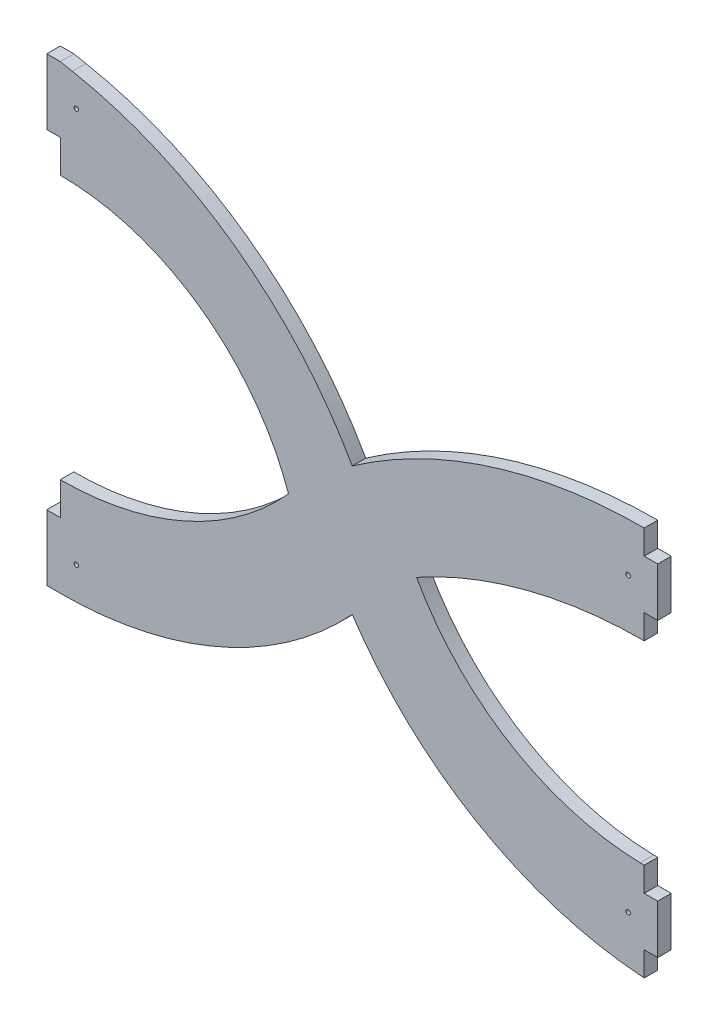
ISO-10303-21;
HEADER;
FILE_DESCRIPTION(('STEP AP214'),'2;1');
FILE_NAME('part.step','',(''),(''),'','','');
FILE_SCHEMA(('AUTOMOTIVE_DESIGN { 1 0 10303 214 1 1 1 1 }'));
ENDSEC;
DATA;
#1=APPLICATION_CONTEXT('core data for automotive mechanical design processes');
#2=APPLICATION_PROTOCOL_DEFINITION('international standard','automotive_design',2000,#1);
#3=PRODUCT_CONTEXT('',#1,'mechanical');
#4=PRODUCT('Part','Part','',(#3));
#5=PRODUCT_RELATED_PRODUCT_CATEGORY('part','',(#4));
#6=PRODUCT_DEFINITION_FORMATION('','',#4);
#7=PRODUCT_DEFINITION_CONTEXT('part definition',#1,'design');
#8=PRODUCT_DEFINITION('design','',#6,#7);
#9=PRODUCT_DEFINITION_SHAPE('','',#8);
#10=(LENGTH_UNIT() NAMED_UNIT(*) SI_UNIT(.MILLI.,.METRE.));
#11=(NAMED_UNIT(*) PLANE_ANGLE_UNIT() SI_UNIT($,.RADIAN.));
#12=(NAMED_UNIT(*) SI_UNIT($,.STERADIAN.) SOLID_ANGLE_UNIT());
#13=UNCERTAINTY_MEASURE_WITH_UNIT(LENGTH_MEASURE(1.E-05),#10,'distance_accuracy_value','');
#14=(GEOMETRIC_REPRESENTATION_CONTEXT(3) GLOBAL_UNCERTAINTY_ASSIGNED_CONTEXT((#13)) GLOBAL_UNIT_ASSIGNED_CONTEXT((#10,
#11,#12)) REPRESENTATION_CONTEXT('',''));
#15=CARTESIAN_POINT('',(0.,0.,0.));
#16=DIRECTION('',(0.,0.,1.));
#17=DIRECTION('',(1.,0.,0.));
#18=AXIS2_PLACEMENT_3D('',#15,#16,#17);
#19=CARTESIAN_POINT('',(-136.645797883599,-91.4289196894211,0.));
#20=DIRECTION('',(0.0703101448035491,0.997525179400352,0.));
#21=DIRECTION('',(-0.997525179400352,0.0703101448035491,0.));
#22=AXIS2_PLACEMENT_3D('',#19,#20,#21);
#23=PLANE('',#22);
#24=DIRECTION('',(0.,0.,1.));
#25=VECTOR('',#24,1.);
#26=CARTESIAN_POINT('',(93.309245370992,-107.637204676529,0.));
#27=LINE('',#26,#25);
#28=CARTESIAN_POINT('',(93.309245370992,-107.637204676529,0.));
#29=VERTEX_POINT('',#28);
#30=CARTESIAN_POINT('',(93.309245370992,-107.637204676529,5.334));
#31=VERTEX_POINT('',#30);
#32=EDGE_CURVE('E407',#29,#31,#27,.T.);
#33=ORIENTED_EDGE('',*,*,#32,.F.);
#34=DIRECTION('',(-0.997525179400352,0.0703101448035491,0.));
#35=VECTOR('',#34,1.);
#36=CARTESIAN_POINT('',(-136.645797883599,-91.4289196894211,0.));
#37=LINE('',#36,#35);
#38=CARTESIAN_POINT('',(93.9862021164005,-107.684919689421,0.));
#39=VERTEX_POINT('',#38);
#40=EDGE_CURVE('E403',#39,#29,#37,.T.);
#41=ORIENTED_EDGE('',*,*,#40,.F.);
#42=DIRECTION('',(0.,0.,1.));
#43=VECTOR('',#42,1.);
#44=CARTESIAN_POINT('',(93.9862021164005,-107.684919689421,0.));
#45=LINE('',#44,#43);
#46=CARTESIAN_POINT('',(93.9862021164005,-107.684919689421,5.334));
#47=VERTEX_POINT('',#46);
#48=EDGE_CURVE('E315',#39,#47,#45,.T.);
#49=ORIENTED_EDGE('',*,*,#48,.T.);
#50=DIRECTION('',(-0.997525179400352,0.0703101448035491,0.));
#51=VECTOR('',#50,1.);
#52=CARTESIAN_POINT('',(-136.645797883599,-91.4289196894211,5.334));
#53=LINE('',#52,#51);
#54=EDGE_CURVE('E398',#47,#31,#53,.T.);
#55=ORIENTED_EDGE('',*,*,#54,.T.);
#56=EDGE_LOOP('',(#33,#41,#49,#55));
#57=FACE_BOUND('',#56,.T.);
#58=ADVANCED_FACE('F35',(#57),#23,.F.);
#59=CARTESIAN_POINT('',(-136.6457978836,90.4350803105789,0.));
#60=DIRECTION('',(-0.188205466723379,-0.982129676924303,0.));
#61=DIRECTION('',(0.982129676924303,-0.188205466723379,0.));
#62=AXIS2_PLACEMENT_3D('',#59,#60,#61);
#63=PLANE('',#62);
#64=DIRECTION('',(0.,0.,1.));
#65=VECTOR('',#64,1.);
#66=CARTESIAN_POINT('',(-131.856888589873,89.5173818335872,0.));
#67=LINE('',#66,#65);
#68=CARTESIAN_POINT('',(-131.856888589873,89.5173818335872,0.));
#69=VERTEX_POINT('',#68);
#70=CARTESIAN_POINT('',(-131.856888589873,89.5173818335872,5.334));
#71=VERTEX_POINT('',#70);
#72=EDGE_CURVE('E448',#69,#71,#67,.T.);
#73=ORIENTED_EDGE('',*,*,#72,.F.);
#74=DIRECTION('',(0.982129676924303,-0.188205466723379,0.));
#75=VECTOR('',#74,1.);
#76=CARTESIAN_POINT('',(-136.6457978836,90.4350803105789,0.));
#77=LINE('',#76,#75);
#78=CARTESIAN_POINT('',(-136.6457978836,90.4350803105789,0.));
#79=VERTEX_POINT('',#78);
#80=EDGE_CURVE('E395',#79,#69,#77,.T.);
#81=ORIENTED_EDGE('',*,*,#80,.F.);
#82=DIRECTION('',(0.,0.,1.));
#83=VECTOR('',#82,1.);
#84=CARTESIAN_POINT('',(-136.6457978836,90.4350803105789,0.));
#85=LINE('',#84,#83);
#86=CARTESIAN_POINT('',(-136.6457978836,90.4350803105789,5.334));
#87=VERTEX_POINT('',#86);
#88=EDGE_CURVE('E392',#79,#87,#85,.T.);
#89=ORIENTED_EDGE('',*,*,#88,.T.);
#90=DIRECTION('',(0.982129676924303,-0.188205466723379,0.));
#91=VECTOR('',#90,1.);
#92=CARTESIAN_POINT('',(-136.6457978836,90.4350803105789,5.334));
#93=LINE('',#92,#91);
#94=EDGE_CURVE('E389',#87,#71,#93,.T.);
#95=ORIENTED_EDGE('',*,*,#94,.T.);
#96=EDGE_LOOP('',(#73,#81,#89,#95));
#97=FACE_BOUND('',#96,.T.);
#98=ADVANCED_FACE('F477',(#97),#63,.F.);
#99=CARTESIAN_POINT('',(93.9862021164005,17.2830803105789,0.));
#100=DIRECTION('',(-1.,0.,0.));
#101=DIRECTION('',(0.,-1.,0.));
#102=AXIS2_PLACEMENT_3D('',#99,#100,#101);
#103=PLANE('',#102);
#104=DIRECTION('',(0.,-1.,0.));
#105=VECTOR('',#104,1.);
#106=CARTESIAN_POINT('',(93.9862021164005,17.2830803105789,0.));
#107=LINE('',#106,#105);
#108=CARTESIAN_POINT('',(93.9862021164005,-69.0816387034577,0.));
#109=VERTEX_POINT('',#108);
#110=CARTESIAN_POINT('',(93.9862021164005,-78.7289196894211,0.));
#111=VERTEX_POINT('',#110);
#112=EDGE_CURVE('E277',#109,#111,#107,.T.);
#113=ORIENTED_EDGE('',*,*,#112,.F.);
#114=DIRECTION('',(0.,0.,1.));
#115=VECTOR('',#114,1.);
#116=CARTESIAN_POINT('',(93.9862021164005,-69.0816387034577,0.));
#117=LINE('',#116,#115);
#118=CARTESIAN_POINT('',(93.9862021164005,-69.0816387034577,5.334));
#119=VERTEX_POINT('',#118);
#120=EDGE_CURVE('E11',#109,#119,#117,.T.);
#121=ORIENTED_EDGE('',*,*,#120,.T.);
#122=DIRECTION('',(0.,-1.,0.));
#123=VECTOR('',#122,1.);
#124=CARTESIAN_POINT('',(93.9862021164005,17.2830803105789,5.334));
#125=LINE('',#124,#123);
#126=CARTESIAN_POINT('',(93.9862021164005,-78.7289196894211,5.334));
#127=VERTEX_POINT('',#126);
#128=EDGE_CURVE('E288',#119,#127,#125,.T.);
#129=ORIENTED_EDGE('',*,*,#128,.T.);
#130=DIRECTION('',(0.,0.,1.));
#131=VECTOR('',#130,1.);
#132=CARTESIAN_POINT('',(93.9862021164005,-78.7289196894211,0.));
#133=LINE('',#132,#131);
#134=EDGE_CURVE('E297',#111,#127,#133,.T.);
#135=ORIENTED_EDGE('',*,*,#134,.F.);
#136=EDGE_LOOP('',(#113,#121,#129,#135));
#137=FACE_BOUND('',#136,.T.);
#138=ADVANCED_FACE('F434',(#137),#103,.F.);
#139=CARTESIAN_POINT('',(-136.645797883599,-65.5209196894211,0.));
#140=DIRECTION('',(1.,0.,0.));
#141=DIRECTION('',(0.,0.,-1.));
#142=AXIS2_PLACEMENT_3D('',#139,#140,#141);
#143=PLANE('',#142);
#144=DIRECTION('',(0.,1.,0.));
#145=VECTOR('',#144,1.);
#146=CARTESIAN_POINT('',(-136.645797883599,-65.5209196894211,0.));
#147=LINE('',#146,#145);
#148=CARTESIAN_POINT('',(-136.6457978836,51.5730803105789,0.));
#149=VERTEX_POINT('',#148);
#150=CARTESIAN_POINT('',(-136.645797883599,64.5270803105789,0.));
#151=VERTEX_POINT('',#150);
#152=EDGE_CURVE('E354',#149,#151,#147,.T.);
#153=ORIENTED_EDGE('',*,*,#152,.F.);
#154=DIRECTION('',(0.,0.,1.));
#155=VECTOR('',#154,1.);
#156=CARTESIAN_POINT('',(-136.6457978836,51.5730803105789,0.));
#157=LINE('',#156,#155);
#158=CARTESIAN_POINT('',(-136.6457978836,51.5730803105789,5.334));
#159=VERTEX_POINT('',#158);
#160=EDGE_CURVE('E472',#149,#159,#157,.T.);
#161=ORIENTED_EDGE('',*,*,#160,.T.);
#162=DIRECTION('',(0.,1.,0.));
#163=VECTOR('',#162,1.);
#164=CARTESIAN_POINT('',(-136.645797883599,-65.5209196894211,5.334));
#165=LINE('',#164,#163);
#166=CARTESIAN_POINT('',(-136.645797883599,64.5270803105789,5.334));
#167=VERTEX_POINT('',#166);
#168=EDGE_CURVE('E371',#159,#167,#165,.T.);
#169=ORIENTED_EDGE('',*,*,#168,.T.);
#170=DIRECTION('',(0.,0.,1.));
#171=VECTOR('',#170,1.);
#172=CARTESIAN_POINT('',(-136.645797883599,64.5270803105789,0.));
#173=LINE('',#172,#171);
#174=EDGE_CURVE('E254',#151,#167,#173,.T.);
#175=ORIENTED_EDGE('',*,*,#174,.F.);
#176=EDGE_LOOP('',(#153,#161,#169,#175));
#177=FACE_BOUND('',#176,.T.);
#178=ADVANCED_FACE('F530',(#177),#143,.F.);
#179=CARTESIAN_POINT('',(-141.9797978836,90.4350803105789,5.334));
#180=DIRECTION('',(1.,0.,0.));
#181=DIRECTION('',(0.,0.,-1.));
#182=AXIS2_PLACEMENT_3D('',#179,#180,#181);
#183=PLANE('',#182);
#184=DIRECTION('',(0.,-1.,0.));
#185=VECTOR('',#184,1.);
#186=CARTESIAN_POINT('',(-141.9797978836,90.4350803105789,5.334));
#187=LINE('',#186,#185);
#188=CARTESIAN_POINT('',(-141.9797978836,-65.5209196894211,5.334));
#189=VERTEX_POINT('',#188);
#190=CARTESIAN_POINT('',(-141.9797978836,-91.4289196894211,5.334));
#191=VERTEX_POINT('',#190);
#192=EDGE_CURVE('E325',#189,#191,#187,.T.);
#193=ORIENTED_EDGE('',*,*,#192,.F.);
#194=DIRECTION('',(0.,0.,1.));
#195=VECTOR('',#194,1.);
#196=CARTESIAN_POINT('',(-141.9797978836,-65.5209196894211,0.));
#197=LINE('',#196,#195);
#198=CARTESIAN_POINT('',(-141.9797978836,-65.5209196894211,0.));
#199=VERTEX_POINT('',#198);
#200=EDGE_CURVE('E377',#199,#189,#197,.T.);
#201=ORIENTED_EDGE('',*,*,#200,.F.);
#202=DIRECTION('',(0.,-1.,0.));
#203=VECTOR('',#202,1.);
#204=CARTESIAN_POINT('',(-141.9797978836,90.4350803105789,0.));
#205=LINE('',#204,#203);
#206=CARTESIAN_POINT('',(-141.9797978836,-91.4289196894211,0.));
#207=VERTEX_POINT('',#206);
#208=EDGE_CURVE('E317',#199,#207,#205,.T.);
#209=ORIENTED_EDGE('',*,*,#208,.T.);
#210=DIRECTION('',(0.,0.,1.));
#211=VECTOR('',#210,1.);
#212=CARTESIAN_POINT('',(-141.9797978836,-91.4289196894211,0.));
#213=LINE('',#212,#211);
#214=EDGE_CURVE('E236',#207,#191,#213,.T.);
#215=ORIENTED_EDGE('',*,*,#214,.T.);
#216=EDGE_LOOP('',(#193,#201,#209,#215));
#217=FACE_BOUND('',#216,.T.);
#218=ADVANCED_FACE('F568',(#217),#183,.F.);
#219=CARTESIAN_POINT('',(99.3202021164005,90.4350803105789,5.334));
#220=DIRECTION('',(-1.,0.,0.));
#221=DIRECTION('',(0.,-1.,0.));
#222=AXIS2_PLACEMENT_3D('',#219,#220,#221);
#223=PLANE('',#222);
#224=DIRECTION('',(0.,1.,0.));
#225=VECTOR('',#224,1.);
#226=CARTESIAN_POINT('',(99.3202021164005,90.4350803105789,0.));
#227=LINE('',#226,#225);
#228=CARTESIAN_POINT('',(99.3202021164005,-98.0329196894211,0.));
#229=VERTEX_POINT('',#228);
#230=CARTESIAN_POINT('',(99.3202021164005,-78.7289196894211,0.));
#231=VERTEX_POINT('',#230);
#232=EDGE_CURVE('E335',#229,#231,#227,.T.);
#233=ORIENTED_EDGE('',*,*,#232,.T.);
#234=DIRECTION('',(0.,0.,1.));
#235=VECTOR('',#234,1.);
#236=CARTESIAN_POINT('',(99.3202021164005,-78.7289196894211,0.));
#237=LINE('',#236,#235);
#238=CARTESIAN_POINT('',(99.3202021164005,-78.7289196894211,5.334));
#239=VERTEX_POINT('',#238);
#240=EDGE_CURVE('E293',#231,#239,#237,.T.);
#241=ORIENTED_EDGE('',*,*,#240,.T.);
#242=DIRECTION('',(0.,1.,0.));
#243=VECTOR('',#242,1.);
#244=CARTESIAN_POINT('',(99.3202021164005,90.4350803105789,5.334));
#245=LINE('',#244,#243);
#246=CARTESIAN_POINT('',(99.3202021164005,-98.0329196894211,5.334));
#247=VERTEX_POINT('',#246);
#248=EDGE_CURVE('E326',#247,#239,#245,.T.);
#249=ORIENTED_EDGE('',*,*,#248,.F.);
#250=DIRECTION('',(0.,0.,1.));
#251=VECTOR('',#250,1.);
#252=CARTESIAN_POINT('',(99.3202021164005,-98.0329196894211,0.));
#253=LINE('',#252,#251);
#254=EDGE_CURVE('E310',#229,#247,#253,.T.);
#255=ORIENTED_EDGE('',*,*,#254,.F.);
#256=EDGE_LOOP('',(#233,#241,#249,#255));
#257=FACE_BOUND('',#256,.T.);
#258=ADVANCED_FACE('F422',(#257),#223,.F.);
#259=CARTESIAN_POINT('',(-141.9797978836,90.4350803105789,0.));
#260=VERTEX_POINT('',#259);
#261=CARTESIAN_POINT('',(-141.9797978836,64.5270803105789,0.));
#262=VERTEX_POINT('',#261);
#263=EDGE_CURVE('E331',#260,#262,#205,.T.);
#264=ORIENTED_EDGE('',*,*,#263,.T.);
#265=DIRECTION('',(0.,0.,1.));
#266=VECTOR('',#265,1.);
#267=CARTESIAN_POINT('',(-141.9797978836,64.5270803105789,0.));
#268=LINE('',#267,#266);
#269=CARTESIAN_POINT('',(-141.9797978836,64.5270803105789,5.334));
#270=VERTEX_POINT('',#269);
#271=EDGE_CURVE('E378',#262,#270,#268,.T.);
#272=ORIENTED_EDGE('',*,*,#271,.T.);
#273=CARTESIAN_POINT('',(-141.9797978836,90.4350803105789,5.334));
#274=VERTEX_POINT('',#273);
#275=EDGE_CURVE('E321',#274,#270,#187,.T.);
#276=ORIENTED_EDGE('',*,*,#275,.F.);
#277=DIRECTION('',(0.,0.,-1.));
#278=VECTOR('',#277,1.);
#279=CARTESIAN_POINT('',(-141.9797978836,90.4350803105789,5.334));
#280=LINE('',#279,#278);
#281=EDGE_CURVE('E43',#274,#260,#280,.T.);
#282=ORIENTED_EDGE('',*,*,#281,.T.);
#283=EDGE_LOOP('',(#264,#272,#276,#282));
#284=FACE_BOUND('',#283,.T.);
#285=ADVANCED_FACE('F37',(#284),#183,.F.);
#286=CARTESIAN_POINT('',(99.3202021164005,17.2830803105789,0.));
#287=VERTEX_POINT('',#286);
#288=CARTESIAN_POINT('',(99.3202021164005,36.5870803105789,0.));
#289=VERTEX_POINT('',#288);
#290=EDGE_CURVE('E334',#287,#289,#227,.T.);
#291=ORIENTED_EDGE('',*,*,#290,.T.);
#292=DIRECTION('',(0.,0.,1.));
#293=VECTOR('',#292,1.);
#294=CARTESIAN_POINT('',(99.3202021164005,36.5870803105789,0.));
#295=LINE('',#294,#293);
#296=CARTESIAN_POINT('',(99.3202021164005,36.5870803105789,5.334));
#297=VERTEX_POINT('',#296);
#298=EDGE_CURVE('E268',#289,#297,#295,.T.);
#299=ORIENTED_EDGE('',*,*,#298,.T.);
#300=CARTESIAN_POINT('',(99.3202021164005,17.2830803105789,5.334));
#301=VERTEX_POINT('',#300);
#302=EDGE_CURVE('E324',#301,#297,#245,.T.);
#303=ORIENTED_EDGE('',*,*,#302,.F.);
#304=DIRECTION('',(0.,0.,1.));
#305=VECTOR('',#304,1.);
#306=CARTESIAN_POINT('',(99.3202021164005,17.2830803105789,0.));
#307=LINE('',#306,#305);
#308=EDGE_CURVE('E285',#287,#301,#307,.T.);
#309=ORIENTED_EDGE('',*,*,#308,.F.);
#310=EDGE_LOOP('',(#291,#299,#303,#309));
#311=FACE_BOUND('',#310,.T.);
#312=ADVANCED_FACE('F562',(#311),#223,.F.);
#313=CARTESIAN_POINT('',(-141.9797978836,90.4350803105789,5.334));
#314=DIRECTION('',(0.,-1.,0.));
#315=DIRECTION('',(0.,0.,-1.));
#316=AXIS2_PLACEMENT_3D('',#313,#314,#315);
#317=PLANE('',#316);
#318=DIRECTION('',(-1.,0.,0.));
#319=VECTOR('',#318,1.);
#320=CARTESIAN_POINT('',(-141.9797978836,90.4350803105789,5.334));
#321=LINE('',#320,#319);
#322=EDGE_CURVE('E329',#87,#274,#321,.T.);
#323=ORIENTED_EDGE('',*,*,#322,.F.);
#324=ORIENTED_EDGE('',*,*,#88,.F.);
#325=DIRECTION('',(-1.,0.,0.));
#326=VECTOR('',#325,1.);
#327=CARTESIAN_POINT('',(-141.9797978836,90.4350803105789,0.));
#328=LINE('',#327,#326);
#329=EDGE_CURVE('E338',#79,#260,#328,.T.);
#330=ORIENTED_EDGE('',*,*,#329,.T.);
#331=ORIENTED_EDGE('',*,*,#281,.F.);
#332=EDGE_LOOP('',(#323,#324,#330,#331));
#333=FACE_BOUND('',#332,.T.);
#334=ADVANCED_FACE('F391',(#333),#317,.F.);
#335=CARTESIAN_POINT('',(0.,0.,5.334));
#336=DIRECTION('',(0.,0.,1.));
#337=DIRECTION('',(1.,0.,0.));
#338=AXIS2_PLACEMENT_3D('',#335,#336,#337);
#339=PLANE('',#338);
#340=CARTESIAN_POINT('',(87.6362021164005,-88.3809196894211,5.334));
#341=DIRECTION('',(0.,0.,1.));
#342=DIRECTION('',(-1.,0.,0.));
#343=AXIS2_PLACEMENT_3D('',#340,#341,#342);
#344=CIRCLE('',#343,0.888999999999989);
#345=CARTESIAN_POINT('',(86.7472021164005,-88.3809196894211,5.334));
#346=VERTEX_POINT('',#345);
#347=EDGE_CURVE('E715',#346,#346,#344,.T.);
#348=ORIENTED_EDGE('',*,*,#347,.F.);
#349=EDGE_LOOP('',(#348));
#350=FACE_BOUND('',#349,.T.);
#351=CARTESIAN_POINT('',(87.6362021164005,26.9350803105789,5.334));
#352=DIRECTION('',(0.,0.,1.));
#353=DIRECTION('',(1.,0.,0.));
#354=AXIS2_PLACEMENT_3D('',#351,#352,#353);
#355=CIRCLE('',#354,0.889000000000003);
#356=CARTESIAN_POINT('',(88.5252021164005,26.9350803105789,5.334));
#357=VERTEX_POINT('',#356);
#358=EDGE_CURVE('E717',#357,#357,#355,.T.);
#359=ORIENTED_EDGE('',*,*,#358,.F.);
#360=EDGE_LOOP('',(#359));
#361=FACE_BOUND('',#360,.T.);
#362=CARTESIAN_POINT('',(-130.2957978836,-78.4749196894211,5.334));
#363=DIRECTION('',(0.,0.,1.));
#364=DIRECTION('',(-1.,0.,0.));
#365=AXIS2_PLACEMENT_3D('',#362,#363,#364);
#366=CIRCLE('',#365,0.888999999999989);
#367=CARTESIAN_POINT('',(-131.1847978836,-78.4749196894211,5.334));
#368=VERTEX_POINT('',#367);
#369=EDGE_CURVE('E723',#368,#368,#366,.T.);
#370=ORIENTED_EDGE('',*,*,#369,.F.);
#371=EDGE_LOOP('',(#370));
#372=FACE_BOUND('',#371,.T.);
#373=CARTESIAN_POINT('',(-130.2957978836,77.4810803105789,5.334));
#374=DIRECTION('',(0.,0.,1.));
#375=DIRECTION('',(1.,0.,0.));
#376=AXIS2_PLACEMENT_3D('',#373,#374,#375);
#377=CIRCLE('',#376,0.888999999999989);
#378=CARTESIAN_POINT('',(-129.4067978836,77.4810803105789,5.334));
#379=VERTEX_POINT('',#378);
#380=EDGE_CURVE('E729',#379,#379,#377,.T.);
#381=ORIENTED_EDGE('',*,*,#380,.F.);
#382=EDGE_LOOP('',(#381));
#383=FACE_BOUND('',#382,.T.);
#384=CARTESIAN_POINT('',(-136.6457978836,65.6532856002515,5.334));
#385=DIRECTION('',(0.,0.,-1.));
#386=DIRECTION('',(1.,0.,0.));
#387=AXIS2_PLACEMENT_3D('',#384,#385,#386);
#388=CIRCLE('',#387,157.082205289673);
#389=CARTESIAN_POINT('',(-21.3297978835995,-41.0099196894211,5.334));
#390=VERTEX_POINT('',#389);
#391=CARTESIAN_POINT('',(-136.645797883599,-91.4289196894211,5.334));
#392=VERTEX_POINT('',#391);
#393=EDGE_CURVE('E231',#390,#392,#388,.T.);
#394=ORIENTED_EDGE('',*,*,#393,.F.);
#395=CARTESIAN_POINT('',(103.892338032469,42.5098152847798,5.334));
#396=DIRECTION('',(0.,0.,-1.));
#397=DIRECTION('',(-1.,0.,0.));
#398=AXIS2_PLACEMENT_3D('',#395,#396,#397);
#399=CIRCLE('',#398,150.519531800837);
#400=EDGE_CURVE('E244',#31,#390,#399,.T.);
#401=ORIENTED_EDGE('',*,*,#400,.F.);
#402=ORIENTED_EDGE('',*,*,#54,.F.);
#403=DIRECTION('',(0.,-1.,0.));
#404=VECTOR('',#403,1.);
#405=CARTESIAN_POINT('',(93.9862021164005,-107.684919689421,5.334));
#406=LINE('',#405,#404);
#407=CARTESIAN_POINT('',(93.9862021164005,-98.0329196894211,5.334));
#408=VERTEX_POINT('',#407);
#409=EDGE_CURVE('E307',#408,#47,#406,.T.);
#410=ORIENTED_EDGE('',*,*,#409,.F.);
#411=DIRECTION('',(-1.,0.,0.));
#412=VECTOR('',#411,1.);
#413=CARTESIAN_POINT('',(99.3202021164005,-98.0329196894211,5.334));
#414=LINE('',#413,#412);
#415=EDGE_CURVE('E296',#247,#408,#414,.T.);
#416=ORIENTED_EDGE('',*,*,#415,.F.);
#417=ORIENTED_EDGE('',*,*,#248,.T.);
#418=DIRECTION('',(1.,0.,0.));
#419=VECTOR('',#418,1.);
#420=CARTESIAN_POINT('',(99.3202021164005,-78.7289196894211,5.334));
#421=LINE('',#420,#419);
#422=EDGE_CURVE('E278',#127,#239,#421,.T.);
#423=ORIENTED_EDGE('',*,*,#422,.F.);
#424=ORIENTED_EDGE('',*,*,#128,.F.);
#425=CARTESIAN_POINT('',(93.277488402385,-30.7252791964394,5.334));
#426=DIRECTION('',(0.,0.,1.));
#427=DIRECTION('',(1.,0.,0.));
#428=AXIS2_PLACEMENT_3D('',#425,#426,#427);
#429=CIRCLE('',#428,38.3629064300408);
#430=CARTESIAN_POINT('',(92.3478318759479,-69.0769196894211,5.334));
#431=VERTEX_POINT('',#430);
#432=EDGE_CURVE('E438',#431,#119,#429,.T.);
#433=ORIENTED_EDGE('',*,*,#432,.F.);
#434=CARTESIAN_POINT('',(94.8630692227126,34.6855729459791,5.334));
#435=DIRECTION('',(0.,0.,1.));
#436=DIRECTION('',(1.,0.,0.));
#437=AXIS2_PLACEMENT_3D('',#434,#435,#436);
#438=CIRCLE('',#437,103.792973253598);
#439=CARTESIAN_POINT('',(4.07020211640044,-15.6099196894211,5.334));
#440=VERTEX_POINT('',#439);
#441=EDGE_CURVE('E441',#440,#431,#438,.T.);
#442=ORIENTED_EDGE('',*,*,#441,.F.);
#443=CARTESIAN_POINT('',(93.9862021164005,-177.92528854188,5.334));
#444=DIRECTION('',(0.,0.,1.));
#445=DIRECTION('',(1.,0.,0.));
#446=AXIS2_PLACEMENT_3D('',#443,#444,#445);
#447=CIRCLE('',#446,185.556368852459);
#448=CARTESIAN_POINT('',(93.9862021164005,7.63108031057891,5.334));
#449=VERTEX_POINT('',#448);
#450=EDGE_CURVE('E443',#449,#440,#447,.T.);
#451=ORIENTED_EDGE('',*,*,#450,.F.);
#452=CARTESIAN_POINT('',(93.9862021164005,17.2830803105789,5.334));
#453=VERTEX_POINT('',#452);
#454=EDGE_CURVE('E289',#453,#449,#125,.T.);
#455=ORIENTED_EDGE('',*,*,#454,.F.);
#456=DIRECTION('',(-1.,0.,0.));
#457=VECTOR('',#456,1.);
#458=CARTESIAN_POINT('',(93.9862021164005,17.2830803105789,5.334));
#459=LINE('',#458,#457);
#460=EDGE_CURVE('E271',#301,#453,#459,.T.);
#461=ORIENTED_EDGE('',*,*,#460,.F.);
#462=ORIENTED_EDGE('',*,*,#302,.T.);
#463=DIRECTION('',(1.,0.,0.));
#464=VECTOR('',#463,1.);
#465=CARTESIAN_POINT('',(99.3202021164005,36.5870803105789,5.334));
#466=LINE('',#465,#464);
#467=CARTESIAN_POINT('',(93.9862021164005,36.5870803105789,5.334));
#468=VERTEX_POINT('',#467);
#469=EDGE_CURVE('E262',#468,#297,#466,.T.);
#470=ORIENTED_EDGE('',*,*,#469,.F.);
#471=DIRECTION('',(0.,-1.,0.));
#472=VECTOR('',#471,1.);
#473=CARTESIAN_POINT('',(93.9862021164005,90.4350803105789,5.334));
#474=LINE('',#473,#472);
#475=CARTESIAN_POINT('',(93.9862021164005,46.2390803105789,5.334));
#476=VERTEX_POINT('',#475);
#477=EDGE_CURVE('E257',#476,#468,#474,.T.);
#478=ORIENTED_EDGE('',*,*,#477,.F.);
#479=CARTESIAN_POINT('',(93.9862021164005,-154.401670560501,5.334));
#480=DIRECTION('',(0.,0.,-1.));
#481=DIRECTION('',(1.,0.,0.));
#482=AXIS2_PLACEMENT_3D('',#479,#480,#481);
#483=CIRCLE('',#482,200.64075087108);
#484=CARTESIAN_POINT('',(-21.3297978835995,9.79008031057889,5.334));
#485=VERTEX_POINT('',#484);
#486=EDGE_CURVE('E489',#485,#476,#483,.T.);
#487=ORIENTED_EDGE('',*,*,#486,.F.);
#488=CARTESIAN_POINT('',(-162.252135711497,-69.0962698032817,5.334));
#489=DIRECTION('',(0.,0.,-1.));
#490=DIRECTION('',(-1.,0.,0.));
#491=AXIS2_PLACEMENT_3D('',#488,#489,#490);
#492=CIRCLE('',#491,161.499726108643);
#493=EDGE_CURVE('E485',#71,#485,#492,.T.);
#494=ORIENTED_EDGE('',*,*,#493,.F.);
#495=ORIENTED_EDGE('',*,*,#94,.F.);
#496=ORIENTED_EDGE('',*,*,#322,.T.);
#497=ORIENTED_EDGE('',*,*,#275,.T.);
#498=DIRECTION('',(-1.,0.,0.));
#499=VECTOR('',#498,1.);
#500=CARTESIAN_POINT('',(-136.645797883599,64.5270803105789,5.334));
#501=LINE('',#500,#499);
#502=EDGE_CURVE('E370',#167,#270,#501,.T.);
#503=ORIENTED_EDGE('',*,*,#502,.F.);
#504=ORIENTED_EDGE('',*,*,#168,.F.);
#505=CARTESIAN_POINT('',(-136.6457978836,-43.9510846803431,5.334));
#506=DIRECTION('',(0.,0.,1.));
#507=DIRECTION('',(-1.,0.,0.));
#508=AXIS2_PLACEMENT_3D('',#505,#506,#507);
#509=CIRCLE('',#508,95.5241649909219);
#510=CARTESIAN_POINT('',(-46.5144329806666,-12.3092901998275,5.334));
#511=VERTEX_POINT('',#510);
#512=EDGE_CURVE('E466',#511,#159,#509,.T.);
#513=ORIENTED_EDGE('',*,*,#512,.F.);
#514=CARTESIAN_POINT('',(-136.645797883599,68.4578375420735,5.334));
#515=DIRECTION('',(0.,0.,1.));
#516=DIRECTION('',(1.,0.,0.));
#517=AXIS2_PLACEMENT_3D('',#514,#515,#516);
#518=CIRCLE('',#517,121.024757231495);
#519=CARTESIAN_POINT('',(-136.6457978836,-52.5669196894211,5.334));
#520=VERTEX_POINT('',#519);
#521=EDGE_CURVE('E457',#520,#511,#518,.T.);
#522=ORIENTED_EDGE('',*,*,#521,.F.);
#523=CARTESIAN_POINT('',(-136.645797883599,-65.5209196894211,5.334));
#524=VERTEX_POINT('',#523);
#525=EDGE_CURVE('E367',#524,#520,#165,.T.);
#526=ORIENTED_EDGE('',*,*,#525,.F.);
#527=DIRECTION('',(1.,0.,0.));
#528=VECTOR('',#527,1.);
#529=CARTESIAN_POINT('',(-136.645797883599,-65.5209196894211,5.334));
#530=LINE('',#529,#528);
#531=EDGE_CURVE('E373',#189,#524,#530,.T.);
#532=ORIENTED_EDGE('',*,*,#531,.F.);
#533=ORIENTED_EDGE('',*,*,#192,.T.);
#534=DIRECTION('',(-1.,0.,0.));
#535=VECTOR('',#534,1.);
#536=CARTESIAN_POINT('',(-141.9797978836,-91.4289196894211,5.334));
#537=LINE('',#536,#535);
#538=EDGE_CURVE('E249',#392,#191,#537,.T.);
#539=ORIENTED_EDGE('',*,*,#538,.F.);
#540=EDGE_LOOP('',(#394,#401,#402,#410,#416,#417,#423,#424,#433,#442,#451,#455,#461,#462,#470,
#478,#487,#494,#495,#496,#497,#503,#504,#513,#522,#526,#532,#533,#539));
#541=FACE_BOUND('',#540,.T.);
#542=ADVANCED_FACE('F384',(#350,#361,#372,#383,#541),#339,.T.);
#543=CARTESIAN_POINT('',(0.,0.,0.));
#544=DIRECTION('',(0.,0.,1.));
#545=DIRECTION('',(1.,0.,0.));
#546=AXIS2_PLACEMENT_3D('',#543,#544,#545);
#547=PLANE('',#546);
#548=CARTESIAN_POINT('',(87.6362021164005,-88.3809196894211,0.));
#549=DIRECTION('',(0.,0.,1.));
#550=DIRECTION('',(-1.,0.,0.));
#551=AXIS2_PLACEMENT_3D('',#548,#549,#550);
#552=CIRCLE('',#551,0.888999999999989);
#553=CARTESIAN_POINT('',(86.7472021164005,-88.3809196894211,0.));
#554=VERTEX_POINT('',#553);
#555=EDGE_CURVE('E712',#554,#554,#552,.T.);
#556=ORIENTED_EDGE('',*,*,#555,.T.);
#557=EDGE_LOOP('',(#556));
#558=FACE_BOUND('',#557,.T.);
#559=CARTESIAN_POINT('',(87.6362021164005,26.9350803105789,0.));
#560=DIRECTION('',(0.,0.,1.));
#561=DIRECTION('',(1.,0.,0.));
#562=AXIS2_PLACEMENT_3D('',#559,#560,#561);
#563=CIRCLE('',#562,0.889000000000003);
#564=CARTESIAN_POINT('',(88.5252021164005,26.9350803105789,0.));
#565=VERTEX_POINT('',#564);
#566=EDGE_CURVE('E720',#565,#565,#563,.T.);
#567=ORIENTED_EDGE('',*,*,#566,.T.);
#568=EDGE_LOOP('',(#567));
#569=FACE_BOUND('',#568,.T.);
#570=CARTESIAN_POINT('',(-130.2957978836,-78.4749196894211,0.));
#571=DIRECTION('',(0.,0.,1.));
#572=DIRECTION('',(-1.,0.,0.));
#573=AXIS2_PLACEMENT_3D('',#570,#571,#572);
#574=CIRCLE('',#573,0.888999999999989);
#575=CARTESIAN_POINT('',(-131.1847978836,-78.4749196894211,0.));
#576=VERTEX_POINT('',#575);
#577=EDGE_CURVE('E726',#576,#576,#574,.T.);
#578=ORIENTED_EDGE('',*,*,#577,.T.);
#579=EDGE_LOOP('',(#578));
#580=FACE_BOUND('',#579,.T.);
#581=CARTESIAN_POINT('',(-130.2957978836,77.4810803105789,0.));
#582=DIRECTION('',(0.,0.,1.));
#583=DIRECTION('',(1.,0.,0.));
#584=AXIS2_PLACEMENT_3D('',#581,#582,#583);
#585=CIRCLE('',#584,0.888999999999989);
#586=CARTESIAN_POINT('',(-129.4067978836,77.4810803105789,0.));
#587=VERTEX_POINT('',#586);
#588=EDGE_CURVE('E732',#587,#587,#585,.T.);
#589=ORIENTED_EDGE('',*,*,#588,.T.);
#590=EDGE_LOOP('',(#589));
#591=FACE_BOUND('',#590,.T.);
#592=CARTESIAN_POINT('',(103.892338032469,42.5098152847798,0.));
#593=DIRECTION('',(0.,0.,-1.));
#594=DIRECTION('',(-1.,0.,0.));
#595=AXIS2_PLACEMENT_3D('',#592,#593,#594);
#596=CIRCLE('',#595,150.519531800837);
#597=CARTESIAN_POINT('',(-21.3297978835995,-41.0099196894211,0.));
#598=VERTEX_POINT('',#597);
#599=EDGE_CURVE('E50',#29,#598,#596,.T.);
#600=ORIENTED_EDGE('',*,*,#599,.T.);
#601=CARTESIAN_POINT('',(-136.6457978836,65.6532856002515,0.));
#602=DIRECTION('',(0.,0.,-1.));
#603=DIRECTION('',(1.,0.,0.));
#604=AXIS2_PLACEMENT_3D('',#601,#602,#603);
#605=CIRCLE('',#604,157.082205289673);
#606=CARTESIAN_POINT('',(-136.645797883599,-91.4289196894211,0.));
#607=VERTEX_POINT('',#606);
#608=EDGE_CURVE('E229',#598,#607,#605,.T.);
#609=ORIENTED_EDGE('',*,*,#608,.T.);
#610=DIRECTION('',(-1.,0.,0.));
#611=VECTOR('',#610,1.);
#612=CARTESIAN_POINT('',(-141.9797978836,-91.4289196894211,0.));
#613=LINE('',#612,#611);
#614=EDGE_CURVE('E237',#607,#207,#613,.T.);
#615=ORIENTED_EDGE('',*,*,#614,.T.);
#616=ORIENTED_EDGE('',*,*,#208,.F.);
#617=DIRECTION('',(1.,0.,0.));
#618=VECTOR('',#617,1.);
#619=CARTESIAN_POINT('',(-136.645797883599,-65.5209196894211,0.));
#620=LINE('',#619,#618);
#621=CARTESIAN_POINT('',(-136.645797883599,-65.5209196894211,0.));
#622=VERTEX_POINT('',#621);
#623=EDGE_CURVE('E358',#199,#622,#620,.T.);
#624=ORIENTED_EDGE('',*,*,#623,.T.);
#625=CARTESIAN_POINT('',(-136.645797883599,-52.5669196894211,0.));
#626=VERTEX_POINT('',#625);
#627=EDGE_CURVE('E359',#622,#626,#147,.T.);
#628=ORIENTED_EDGE('',*,*,#627,.T.);
#629=CARTESIAN_POINT('',(-136.645797883599,68.4578375420735,0.));
#630=DIRECTION('',(0.,0.,1.));
#631=DIRECTION('',(1.,0.,0.));
#632=AXIS2_PLACEMENT_3D('',#629,#630,#631);
#633=CIRCLE('',#632,121.024757231495);
#634=CARTESIAN_POINT('',(-46.5144329806666,-12.3092901998275,0.));
#635=VERTEX_POINT('',#634);
#636=EDGE_CURVE('E462',#626,#635,#633,.T.);
#637=ORIENTED_EDGE('',*,*,#636,.T.);
#638=CARTESIAN_POINT('',(-136.6457978836,-43.9510846803431,0.));
#639=DIRECTION('',(0.,0.,1.));
#640=DIRECTION('',(-1.,0.,0.));
#641=AXIS2_PLACEMENT_3D('',#638,#639,#640);
#642=CIRCLE('',#641,95.5241649909219);
#643=EDGE_CURVE('E465',#635,#149,#642,.T.);
#644=ORIENTED_EDGE('',*,*,#643,.T.);
#645=ORIENTED_EDGE('',*,*,#152,.T.);
#646=DIRECTION('',(-1.,0.,0.));
#647=VECTOR('',#646,1.);
#648=CARTESIAN_POINT('',(-136.645797883599,64.5270803105789,0.));
#649=LINE('',#648,#647);
#650=EDGE_CURVE('E351',#151,#262,#649,.T.);
#651=ORIENTED_EDGE('',*,*,#650,.T.);
#652=ORIENTED_EDGE('',*,*,#263,.F.);
#653=ORIENTED_EDGE('',*,*,#329,.F.);
#654=ORIENTED_EDGE('',*,*,#80,.T.);
#655=CARTESIAN_POINT('',(-162.252135711497,-69.0962698032817,0.));
#656=DIRECTION('',(0.,0.,-1.));
#657=DIRECTION('',(-1.,0.,0.));
#658=AXIS2_PLACEMENT_3D('',#655,#656,#657);
#659=CIRCLE('',#658,161.499726108643);
#660=CARTESIAN_POINT('',(-21.3297978835995,9.79008031057889,0.));
#661=VERTEX_POINT('',#660);
#662=EDGE_CURVE('E58',#69,#661,#659,.T.);
#663=ORIENTED_EDGE('',*,*,#662,.T.);
#664=CARTESIAN_POINT('',(93.9862021164005,-154.401670560501,0.));
#665=DIRECTION('',(0.,0.,-1.));
#666=DIRECTION('',(1.,0.,0.));
#667=AXIS2_PLACEMENT_3D('',#664,#665,#666);
#668=CIRCLE('',#667,200.64075087108);
#669=CARTESIAN_POINT('',(93.9862021164005,46.2390803105789,0.));
#670=VERTEX_POINT('',#669);
#671=EDGE_CURVE('E482',#661,#670,#668,.T.);
#672=ORIENTED_EDGE('',*,*,#671,.T.);
#673=DIRECTION('',(0.,-1.,0.));
#674=VECTOR('',#673,1.);
#675=CARTESIAN_POINT('',(93.9862021164005,90.4350803105789,0.));
#676=LINE('',#675,#674);
#677=CARTESIAN_POINT('',(93.9862021164005,36.5870803105789,0.));
#678=VERTEX_POINT('',#677);
#679=EDGE_CURVE('E259',#670,#678,#676,.T.);
#680=ORIENTED_EDGE('',*,*,#679,.T.);
#681=DIRECTION('',(1.,0.,0.));
#682=VECTOR('',#681,1.);
#683=CARTESIAN_POINT('',(99.3202021164005,36.5870803105789,0.));
#684=LINE('',#683,#682);
#685=EDGE_CURVE('E261',#678,#289,#684,.T.);
#686=ORIENTED_EDGE('',*,*,#685,.T.);
#687=ORIENTED_EDGE('',*,*,#290,.F.);
#688=DIRECTION('',(-1.,0.,0.));
#689=VECTOR('',#688,1.);
#690=CARTESIAN_POINT('',(93.9862021164005,17.2830803105789,0.));
#691=LINE('',#690,#689);
#692=CARTESIAN_POINT('',(93.9862021164005,17.2830803105789,0.));
#693=VERTEX_POINT('',#692);
#694=EDGE_CURVE('E274',#287,#693,#691,.T.);
#695=ORIENTED_EDGE('',*,*,#694,.T.);
#696=CARTESIAN_POINT('',(93.9862021164005,7.63108031057891,0.));
#697=VERTEX_POINT('',#696);
#698=EDGE_CURVE('E279',#693,#697,#107,.T.);
#699=ORIENTED_EDGE('',*,*,#698,.T.);
#700=CARTESIAN_POINT('',(93.9862021164005,-177.92528854188,0.));
#701=DIRECTION('',(0.,0.,1.));
#702=DIRECTION('',(1.,0.,0.));
#703=AXIS2_PLACEMENT_3D('',#700,#701,#702);
#704=CIRCLE('',#703,185.556368852459);
#705=CARTESIAN_POINT('',(4.07020211640044,-15.6099196894211,0.));
#706=VERTEX_POINT('',#705);
#707=EDGE_CURVE('E493',#697,#706,#704,.T.);
#708=ORIENTED_EDGE('',*,*,#707,.T.);
#709=CARTESIAN_POINT('',(94.8630692227126,34.6855729459791,0.));
#710=DIRECTION('',(0.,0.,1.));
#711=DIRECTION('',(1.,0.,0.));
#712=AXIS2_PLACEMENT_3D('',#709,#710,#711);
#713=CIRCLE('',#712,103.792973253598);
#714=CARTESIAN_POINT('',(92.3478318759479,-69.0769196894211,0.));
#715=VERTEX_POINT('',#714);
#716=EDGE_CURVE('E451',#706,#715,#713,.T.);
#717=ORIENTED_EDGE('',*,*,#716,.T.);
#718=CARTESIAN_POINT('',(93.277488402385,-30.7252791964394,0.));
#719=DIRECTION('',(0.,0.,1.));
#720=DIRECTION('',(1.,0.,0.));
#721=AXIS2_PLACEMENT_3D('',#718,#719,#720);
#722=CIRCLE('',#721,38.3629064300408);
#723=EDGE_CURVE('E432',#715,#109,#722,.T.);
#724=ORIENTED_EDGE('',*,*,#723,.T.);
#725=ORIENTED_EDGE('',*,*,#112,.T.);
#726=DIRECTION('',(1.,0.,0.));
#727=VECTOR('',#726,1.);
#728=CARTESIAN_POINT('',(99.3202021164005,-78.7289196894211,0.));
#729=LINE('',#728,#727);
#730=EDGE_CURVE('E282',#111,#231,#729,.T.);
#731=ORIENTED_EDGE('',*,*,#730,.T.);
#732=ORIENTED_EDGE('',*,*,#232,.F.);
#733=DIRECTION('',(-1.,0.,0.));
#734=VECTOR('',#733,1.);
#735=CARTESIAN_POINT('',(99.3202021164005,-98.0329196894211,0.));
#736=LINE('',#735,#734);
#737=CARTESIAN_POINT('',(93.9862021164005,-98.0329196894211,0.));
#738=VERTEX_POINT('',#737);
#739=EDGE_CURVE('E303',#229,#738,#736,.T.);
#740=ORIENTED_EDGE('',*,*,#739,.T.);
#741=DIRECTION('',(0.,-1.,0.));
#742=VECTOR('',#741,1.);
#743=CARTESIAN_POINT('',(93.9862021164005,-107.684919689421,0.));
#744=LINE('',#743,#742);
#745=EDGE_CURVE('E306',#738,#39,#744,.T.);
#746=ORIENTED_EDGE('',*,*,#745,.T.);
#747=ORIENTED_EDGE('',*,*,#40,.T.);
#748=EDGE_LOOP('',(#600,#609,#615,#616,#624,#628,#637,#644,#645,#651,#652,#653,#654,#663,#672,
#680,#686,#687,#695,#699,#708,#717,#724,#725,#731,#732,#740,#746,#747));
#749=FACE_BOUND('',#748,.T.);
#750=ADVANCED_FACE('F241',(#558,#569,#580,#591,#749),#547,.F.);
#751=CARTESIAN_POINT('',(93.9862021164005,-107.684919689421,0.));
#752=DIRECTION('',(-1.,0.,0.));
#753=DIRECTION('',(0.,-1.,0.));
#754=AXIS2_PLACEMENT_3D('',#751,#752,#753);
#755=PLANE('',#754);
#756=ORIENTED_EDGE('',*,*,#409,.T.);
#757=ORIENTED_EDGE('',*,*,#48,.F.);
#758=ORIENTED_EDGE('',*,*,#745,.F.);
#759=DIRECTION('',(0.,0.,1.));
#760=VECTOR('',#759,1.);
#761=CARTESIAN_POINT('',(93.9862021164005,-98.0329196894211,0.));
#762=LINE('',#761,#760);
#763=EDGE_CURVE('E318',#738,#408,#762,.T.);
#764=ORIENTED_EDGE('',*,*,#763,.T.);
#765=EDGE_LOOP('',(#756,#757,#758,#764));
#766=FACE_BOUND('',#765,.T.);
#767=ADVANCED_FACE('F414',(#766),#755,.F.);
#768=CARTESIAN_POINT('',(99.3202021164005,-98.0329196894211,0.));
#769=DIRECTION('',(0.,1.,0.));
#770=DIRECTION('',(0.,0.,1.));
#771=AXIS2_PLACEMENT_3D('',#768,#769,#770);
#772=PLANE('',#771);
#773=ORIENTED_EDGE('',*,*,#415,.T.);
#774=ORIENTED_EDGE('',*,*,#763,.F.);
#775=ORIENTED_EDGE('',*,*,#739,.F.);
#776=ORIENTED_EDGE('',*,*,#254,.T.);
#777=EDGE_LOOP('',(#773,#774,#775,#776));
#778=FACE_BOUND('',#777,.T.);
#779=ADVANCED_FACE('F417',(#778),#772,.F.);
#780=CARTESIAN_POINT('',(99.3202021164005,-78.7289196894211,0.));
#781=DIRECTION('',(0.,-1.,0.));
#782=DIRECTION('',(0.,0.,-1.));
#783=AXIS2_PLACEMENT_3D('',#780,#781,#782);
#784=PLANE('',#783);
#785=ORIENTED_EDGE('',*,*,#422,.T.);
#786=ORIENTED_EDGE('',*,*,#240,.F.);
#787=ORIENTED_EDGE('',*,*,#730,.F.);
#788=ORIENTED_EDGE('',*,*,#134,.T.);
#789=EDGE_LOOP('',(#785,#786,#787,#788));
#790=FACE_BOUND('',#789,.T.);
#791=ADVANCED_FACE('F426',(#790),#784,.F.);
#792=ORIENTED_EDGE('',*,*,#454,.T.);
#793=DIRECTION('',(0.,0.,1.));
#794=VECTOR('',#793,1.);
#795=CARTESIAN_POINT('',(93.9862021164005,7.63108031057891,0.));
#796=LINE('',#795,#794);
#797=EDGE_CURVE('E460',#697,#449,#796,.T.);
#798=ORIENTED_EDGE('',*,*,#797,.F.);
#799=ORIENTED_EDGE('',*,*,#698,.F.);
#800=DIRECTION('',(0.,0.,1.));
#801=VECTOR('',#800,1.);
#802=CARTESIAN_POINT('',(93.9862021164005,17.2830803105789,0.));
#803=LINE('',#802,#801);
#804=EDGE_CURVE('E300',#693,#453,#803,.T.);
#805=ORIENTED_EDGE('',*,*,#804,.T.);
#806=EDGE_LOOP('',(#792,#798,#799,#805));
#807=FACE_BOUND('',#806,.T.);
#808=ADVANCED_FACE('F544',(#807),#103,.F.);
#809=CARTESIAN_POINT('',(93.9862021164005,17.2830803105789,0.));
#810=DIRECTION('',(0.,1.,0.));
#811=DIRECTION('',(-1.,0.,0.));
#812=AXIS2_PLACEMENT_3D('',#809,#810,#811);
#813=PLANE('',#812);
#814=ORIENTED_EDGE('',*,*,#460,.T.);
#815=ORIENTED_EDGE('',*,*,#804,.F.);
#816=ORIENTED_EDGE('',*,*,#694,.F.);
#817=ORIENTED_EDGE('',*,*,#308,.T.);
#818=EDGE_LOOP('',(#814,#815,#816,#817));
#819=FACE_BOUND('',#818,.T.);
#820=ADVANCED_FACE('F537',(#819),#813,.F.);
#821=CARTESIAN_POINT('',(99.3202021164005,36.5870803105789,0.));
#822=DIRECTION('',(0.,-1.,0.));
#823=DIRECTION('',(0.,0.,-1.));
#824=AXIS2_PLACEMENT_3D('',#821,#822,#823);
#825=PLANE('',#824);
#826=ORIENTED_EDGE('',*,*,#469,.T.);
#827=ORIENTED_EDGE('',*,*,#298,.F.);
#828=ORIENTED_EDGE('',*,*,#685,.F.);
#829=DIRECTION('',(0.,0.,1.));
#830=VECTOR('',#829,1.);
#831=CARTESIAN_POINT('',(93.9862021164005,36.5870803105789,0.));
#832=LINE('',#831,#830);
#833=EDGE_CURVE('E265',#678,#468,#832,.T.);
#834=ORIENTED_EDGE('',*,*,#833,.T.);
#835=EDGE_LOOP('',(#826,#827,#828,#834));
#836=FACE_BOUND('',#835,.T.);
#837=ADVANCED_FACE('F534',(#836),#825,.F.);
#838=CARTESIAN_POINT('',(93.9862021164005,90.4350803105789,0.));
#839=DIRECTION('',(-1.,0.,0.));
#840=DIRECTION('',(0.,-1.,0.));
#841=AXIS2_PLACEMENT_3D('',#838,#839,#840);
#842=PLANE('',#841);
#843=ORIENTED_EDGE('',*,*,#679,.F.);
#844=DIRECTION('',(0.,0.,1.));
#845=VECTOR('',#844,1.);
#846=CARTESIAN_POINT('',(93.9862021164005,46.2390803105789,0.));
#847=LINE('',#846,#845);
#848=EDGE_CURVE('E394',#670,#476,#847,.T.);
#849=ORIENTED_EDGE('',*,*,#848,.T.);
#850=ORIENTED_EDGE('',*,*,#477,.T.);
#851=ORIENTED_EDGE('',*,*,#833,.F.);
#852=EDGE_LOOP('',(#843,#849,#850,#851));
#853=FACE_BOUND('',#852,.T.);
#854=ADVANCED_FACE('F533',(#853),#842,.F.);
#855=CARTESIAN_POINT('',(-141.9797978836,-91.4289196894211,0.));
#856=DIRECTION('',(0.,1.,0.));
#857=DIRECTION('',(0.,0.,1.));
#858=AXIS2_PLACEMENT_3D('',#855,#856,#857);
#859=PLANE('',#858);
#860=ORIENTED_EDGE('',*,*,#538,.T.);
#861=ORIENTED_EDGE('',*,*,#214,.F.);
#862=ORIENTED_EDGE('',*,*,#614,.F.);
#863=DIRECTION('',(0.,0.,1.));
#864=VECTOR('',#863,1.);
#865=CARTESIAN_POINT('',(-136.645797883599,-91.4289196894211,0.));
#866=LINE('',#865,#864);
#867=EDGE_CURVE('E226',#607,#392,#866,.T.);
#868=ORIENTED_EDGE('',*,*,#867,.T.);
#869=EDGE_LOOP('',(#860,#861,#862,#868));
#870=FACE_BOUND('',#869,.T.);
#871=ADVANCED_FACE('F247',(#870),#859,.F.);
#872=ORIENTED_EDGE('',*,*,#525,.T.);
#873=DIRECTION('',(0.,0.,1.));
#874=VECTOR('',#873,1.);
#875=CARTESIAN_POINT('',(-136.6457978836,-52.5669196894211,0.));
#876=LINE('',#875,#874);
#877=EDGE_CURVE('E468',#626,#520,#876,.T.);
#878=ORIENTED_EDGE('',*,*,#877,.F.);
#879=ORIENTED_EDGE('',*,*,#627,.F.);
#880=DIRECTION('',(0.,0.,1.));
#881=VECTOR('',#880,1.);
#882=CARTESIAN_POINT('',(-136.645797883599,-65.5209196894211,0.));
#883=LINE('',#882,#881);
#884=EDGE_CURVE('E251',#622,#524,#883,.T.);
#885=ORIENTED_EDGE('',*,*,#884,.T.);
#886=EDGE_LOOP('',(#872,#878,#879,#885));
#887=FACE_BOUND('',#886,.T.);
#888=ADVANCED_FACE('F523',(#887),#143,.F.);
#889=CARTESIAN_POINT('',(-136.645797883599,-65.5209196894211,0.));
#890=DIRECTION('',(0.,-1.,0.));
#891=DIRECTION('',(1.,0.,0.));
#892=AXIS2_PLACEMENT_3D('',#889,#890,#891);
#893=PLANE('',#892);
#894=ORIENTED_EDGE('',*,*,#531,.T.);
#895=ORIENTED_EDGE('',*,*,#884,.F.);
#896=ORIENTED_EDGE('',*,*,#623,.F.);
#897=ORIENTED_EDGE('',*,*,#200,.T.);
#898=EDGE_LOOP('',(#894,#895,#896,#897));
#899=FACE_BOUND('',#898,.T.);
#900=ADVANCED_FACE('F520',(#899),#893,.F.);
#901=CARTESIAN_POINT('',(-136.645797883599,64.5270803105789,0.));
#902=DIRECTION('',(0.,1.,0.));
#903=DIRECTION('',(-1.,0.,0.));
#904=AXIS2_PLACEMENT_3D('',#901,#902,#903);
#905=PLANE('',#904);
#906=ORIENTED_EDGE('',*,*,#502,.T.);
#907=ORIENTED_EDGE('',*,*,#271,.F.);
#908=ORIENTED_EDGE('',*,*,#650,.F.);
#909=ORIENTED_EDGE('',*,*,#174,.T.);
#910=EDGE_LOOP('',(#906,#907,#908,#909));
#911=FACE_BOUND('',#910,.T.);
#912=ADVANCED_FACE('F380',(#911),#905,.F.);
#913=CARTESIAN_POINT('',(-136.6457978836,-43.9510846803431,0.));
#914=DIRECTION('',(0.,0.,1.));
#915=DIRECTION('',(1.,0.,0.));
#916=AXIS2_PLACEMENT_3D('',#913,#914,#915);
#917=CYLINDRICAL_SURFACE('',#916,95.5241649909219);
#918=ORIENTED_EDGE('',*,*,#512,.T.);
#919=ORIENTED_EDGE('',*,*,#160,.F.);
#920=ORIENTED_EDGE('',*,*,#643,.F.);
#921=DIRECTION('',(0.,0.,1.));
#922=VECTOR('',#921,1.);
#923=CARTESIAN_POINT('',(-46.5144329806666,-12.3092901998275,0.));
#924=LINE('',#923,#922);
#925=EDGE_CURVE('E475',#635,#511,#924,.T.);
#926=ORIENTED_EDGE('',*,*,#925,.T.);
#927=EDGE_LOOP('',(#918,#919,#920,#926));
#928=FACE_BOUND('',#927,.T.);
#929=ADVANCED_FACE('F508',(#928),#917,.F.);
#930=CARTESIAN_POINT('',(-136.645797883599,68.4578375420735,0.));
#931=DIRECTION('',(0.,0.,1.));
#932=DIRECTION('',(1.,0.,0.));
#933=AXIS2_PLACEMENT_3D('',#930,#931,#932);
#934=CYLINDRICAL_SURFACE('',#933,121.024757231495);
#935=ORIENTED_EDGE('',*,*,#521,.T.);
#936=ORIENTED_EDGE('',*,*,#925,.F.);
#937=ORIENTED_EDGE('',*,*,#636,.F.);
#938=ORIENTED_EDGE('',*,*,#877,.T.);
#939=EDGE_LOOP('',(#935,#936,#937,#938));
#940=FACE_BOUND('',#939,.T.);
#941=ADVANCED_FACE('F500',(#940),#934,.F.);
#942=CARTESIAN_POINT('',(93.277488402385,-30.7252791964394,0.));
#943=DIRECTION('',(0.,0.,1.));
#944=DIRECTION('',(1.,0.,0.));
#945=AXIS2_PLACEMENT_3D('',#942,#943,#944);
#946=CYLINDRICAL_SURFACE('',#945,38.3629064300408);
#947=ORIENTED_EDGE('',*,*,#723,.F.);
#948=DIRECTION('',(0.,0.,1.));
#949=VECTOR('',#948,1.);
#950=CARTESIAN_POINT('',(92.3478318759479,-69.0769196894211,0.));
#951=LINE('',#950,#949);
#952=EDGE_CURVE('E455',#715,#431,#951,.T.);
#953=ORIENTED_EDGE('',*,*,#952,.T.);
#954=ORIENTED_EDGE('',*,*,#432,.T.);
#955=ORIENTED_EDGE('',*,*,#120,.F.);
#956=EDGE_LOOP('',(#947,#953,#954,#955));
#957=FACE_BOUND('',#956,.T.);
#958=ADVANCED_FACE('F498',(#957),#946,.F.);
#959=CARTESIAN_POINT('',(94.8630692227126,34.6855729459791,0.));
#960=DIRECTION('',(0.,0.,1.));
#961=DIRECTION('',(1.,0.,0.));
#962=AXIS2_PLACEMENT_3D('',#959,#960,#961);
#963=CYLINDRICAL_SURFACE('',#962,103.792973253598);
#964=ORIENTED_EDGE('',*,*,#441,.T.);
#965=ORIENTED_EDGE('',*,*,#952,.F.);
#966=ORIENTED_EDGE('',*,*,#716,.F.);
#967=DIRECTION('',(0.,0.,1.));
#968=VECTOR('',#967,1.);
#969=CARTESIAN_POINT('',(4.07020211640044,-15.6099196894211,0.));
#970=LINE('',#969,#968);
#971=EDGE_CURVE('E458',#706,#440,#970,.T.);
#972=ORIENTED_EDGE('',*,*,#971,.T.);
#973=EDGE_LOOP('',(#964,#965,#966,#972));
#974=FACE_BOUND('',#973,.T.);
#975=ADVANCED_FACE('F497',(#974),#963,.F.);
#976=CARTESIAN_POINT('',(93.9862021164005,-177.92528854188,0.));
#977=DIRECTION('',(0.,0.,1.));
#978=DIRECTION('',(1.,0.,0.));
#979=AXIS2_PLACEMENT_3D('',#976,#977,#978);
#980=CYLINDRICAL_SURFACE('',#979,185.556368852459);
#981=ORIENTED_EDGE('',*,*,#450,.T.);
#982=ORIENTED_EDGE('',*,*,#971,.F.);
#983=ORIENTED_EDGE('',*,*,#707,.F.);
#984=ORIENTED_EDGE('',*,*,#797,.T.);
#985=EDGE_LOOP('',(#981,#982,#983,#984));
#986=FACE_BOUND('',#985,.T.);
#987=ADVANCED_FACE('F506',(#986),#980,.F.);
#988=CARTESIAN_POINT('',(93.9862021164005,-154.401670560501,0.));
#989=DIRECTION('',(0.,0.,1.));
#990=DIRECTION('',(1.,0.,0.));
#991=AXIS2_PLACEMENT_3D('',#988,#989,#990);
#992=CYLINDRICAL_SURFACE('',#991,200.64075087108);
#993=ORIENTED_EDGE('',*,*,#486,.T.);
#994=ORIENTED_EDGE('',*,*,#848,.F.);
#995=ORIENTED_EDGE('',*,*,#671,.F.);
#996=DIRECTION('',(0.,0.,1.));
#997=VECTOR('',#996,1.);
#998=CARTESIAN_POINT('',(-21.3297978835995,9.79008031057889,0.));
#999=LINE('',#998,#997);
#1000=EDGE_CURVE('E444',#661,#485,#999,.T.);
#1001=ORIENTED_EDGE('',*,*,#1000,.T.);
#1002=EDGE_LOOP('',(#993,#994,#995,#1001));
#1003=FACE_BOUND('',#1002,.T.);
#1004=ADVANCED_FACE('F616',(#1003),#992,.T.);
#1005=CARTESIAN_POINT('',(-162.252135711497,-69.0962698032817,0.));
#1006=DIRECTION('',(0.,0.,1.));
#1007=DIRECTION('',(1.,0.,0.));
#1008=AXIS2_PLACEMENT_3D('',#1005,#1006,#1007);
#1009=CYLINDRICAL_SURFACE('',#1008,161.499726108643);
#1010=ORIENTED_EDGE('',*,*,#493,.T.);
#1011=ORIENTED_EDGE('',*,*,#1000,.F.);
#1012=ORIENTED_EDGE('',*,*,#662,.F.);
#1013=ORIENTED_EDGE('',*,*,#72,.T.);
#1014=EDGE_LOOP('',(#1010,#1011,#1012,#1013));
#1015=FACE_BOUND('',#1014,.T.);
#1016=ADVANCED_FACE('F625',(#1015),#1009,.T.);
#1017=CARTESIAN_POINT('',(-136.6457978836,65.6532856002515,0.));
#1018=DIRECTION('',(0.,0.,1.));
#1019=DIRECTION('',(1.,0.,0.));
#1020=AXIS2_PLACEMENT_3D('',#1017,#1018,#1019);
#1021=CYLINDRICAL_SURFACE('',#1020,157.082205289673);
#1022=ORIENTED_EDGE('',*,*,#393,.T.);
#1023=ORIENTED_EDGE('',*,*,#867,.F.);
#1024=ORIENTED_EDGE('',*,*,#608,.F.);
#1025=DIRECTION('',(0.,0.,1.));
#1026=VECTOR('',#1025,1.);
#1027=CARTESIAN_POINT('',(-21.3297978835995,-41.0099196894211,0.));
#1028=LINE('',#1027,#1026);
#1029=EDGE_CURVE('E491',#598,#390,#1028,.T.);
#1030=ORIENTED_EDGE('',*,*,#1029,.T.);
#1031=EDGE_LOOP('',(#1022,#1023,#1024,#1030));
#1032=FACE_BOUND('',#1031,.T.);
#1033=ADVANCED_FACE('F228',(#1032),#1021,.T.);
#1034=CARTESIAN_POINT('',(103.892338032469,42.5098152847798,0.));
#1035=DIRECTION('',(0.,0.,1.));
#1036=DIRECTION('',(1.,0.,0.));
#1037=AXIS2_PLACEMENT_3D('',#1034,#1035,#1036);
#1038=CYLINDRICAL_SURFACE('',#1037,150.519531800837);
#1039=ORIENTED_EDGE('',*,*,#400,.T.);
#1040=ORIENTED_EDGE('',*,*,#1029,.F.);
#1041=ORIENTED_EDGE('',*,*,#599,.F.);
#1042=ORIENTED_EDGE('',*,*,#32,.T.);
#1043=EDGE_LOOP('',(#1039,#1040,#1041,#1042));
#1044=FACE_BOUND('',#1043,.T.);
#1045=ADVANCED_FACE('F643',(#1044),#1038,.T.);
#1046=CARTESIAN_POINT('',(-130.2957978836,77.4810803105789,0.));
#1047=DIRECTION('',(0.,0.,1.));
#1048=DIRECTION('',(1.,0.,0.));
#1049=AXIS2_PLACEMENT_3D('',#1046,#1047,#1048);
#1050=CYLINDRICAL_SURFACE('',#1049,0.888999999999989);
#1051=ORIENTED_EDGE('',*,*,#588,.F.);
#1052=EDGE_LOOP('',(#1051));
#1053=FACE_BOUND('',#1052,.T.);
#1054=ORIENTED_EDGE('',*,*,#380,.T.);
#1055=EDGE_LOOP('',(#1054));
#1056=FACE_BOUND('',#1055,.T.);
#1057=ADVANCED_FACE('F652',(#1053,#1056),#1050,.F.);
#1058=CARTESIAN_POINT('',(-130.2957978836,-78.4749196894211,0.));
#1059=DIRECTION('',(0.,0.,1.));
#1060=DIRECTION('',(1.,0.,0.));
#1061=AXIS2_PLACEMENT_3D('',#1058,#1059,#1060);
#1062=CYLINDRICAL_SURFACE('',#1061,0.888999999999989);
#1063=ORIENTED_EDGE('',*,*,#577,.F.);
#1064=EDGE_LOOP('',(#1063));
#1065=FACE_BOUND('',#1064,.T.);
#1066=ORIENTED_EDGE('',*,*,#369,.T.);
#1067=EDGE_LOOP('',(#1066));
#1068=FACE_BOUND('',#1067,.T.);
#1069=ADVANCED_FACE('F661',(#1065,#1068),#1062,.F.);
#1070=CARTESIAN_POINT('',(87.6362021164005,26.9350803105789,0.));
#1071=DIRECTION('',(0.,0.,1.));
#1072=DIRECTION('',(1.,0.,0.));
#1073=AXIS2_PLACEMENT_3D('',#1070,#1071,#1072);
#1074=CYLINDRICAL_SURFACE('',#1073,0.889000000000003);
#1075=ORIENTED_EDGE('',*,*,#566,.F.);
#1076=EDGE_LOOP('',(#1075));
#1077=FACE_BOUND('',#1076,.T.);
#1078=ORIENTED_EDGE('',*,*,#358,.T.);
#1079=EDGE_LOOP('',(#1078));
#1080=FACE_BOUND('',#1079,.T.);
#1081=ADVANCED_FACE('F671',(#1077,#1080),#1074,.F.);
#1082=CARTESIAN_POINT('',(87.6362021164005,-88.3809196894211,0.));
#1083=DIRECTION('',(0.,0.,1.));
#1084=DIRECTION('',(1.,0.,0.));
#1085=AXIS2_PLACEMENT_3D('',#1082,#1083,#1084);
#1086=CYLINDRICAL_SURFACE('',#1085,0.888999999999989);
#1087=ORIENTED_EDGE('',*,*,#555,.F.);
#1088=EDGE_LOOP('',(#1087));
#1089=FACE_BOUND('',#1088,.T.);
#1090=ORIENTED_EDGE('',*,*,#347,.T.);
#1091=EDGE_LOOP('',(#1090));
#1092=FACE_BOUND('',#1091,.T.);
#1093=ADVANCED_FACE('F695',(#1089,#1092),#1086,.F.);
#1094=CLOSED_SHELL('',(#58,#98,#138,#178,#218,#258,#285,#312,#334,#542,#750,#767,#779,#791,#808,
#820,#837,#854,#871,#888,#900,#912,#929,#941,#958,#975,#987,#1004,#1016,#1033,#1045,#1057,#1069,
#1081,#1093));
#1095=MANIFOLD_SOLID_BREP('B2',#1094);
#1096=ADVANCED_BREP_SHAPE_REPRESENTATION('',(#18,#1095),#14);
#1097=SHAPE_DEFINITION_REPRESENTATION(#9,#1096);
ENDSEC;
END-ISO-10303-21;
